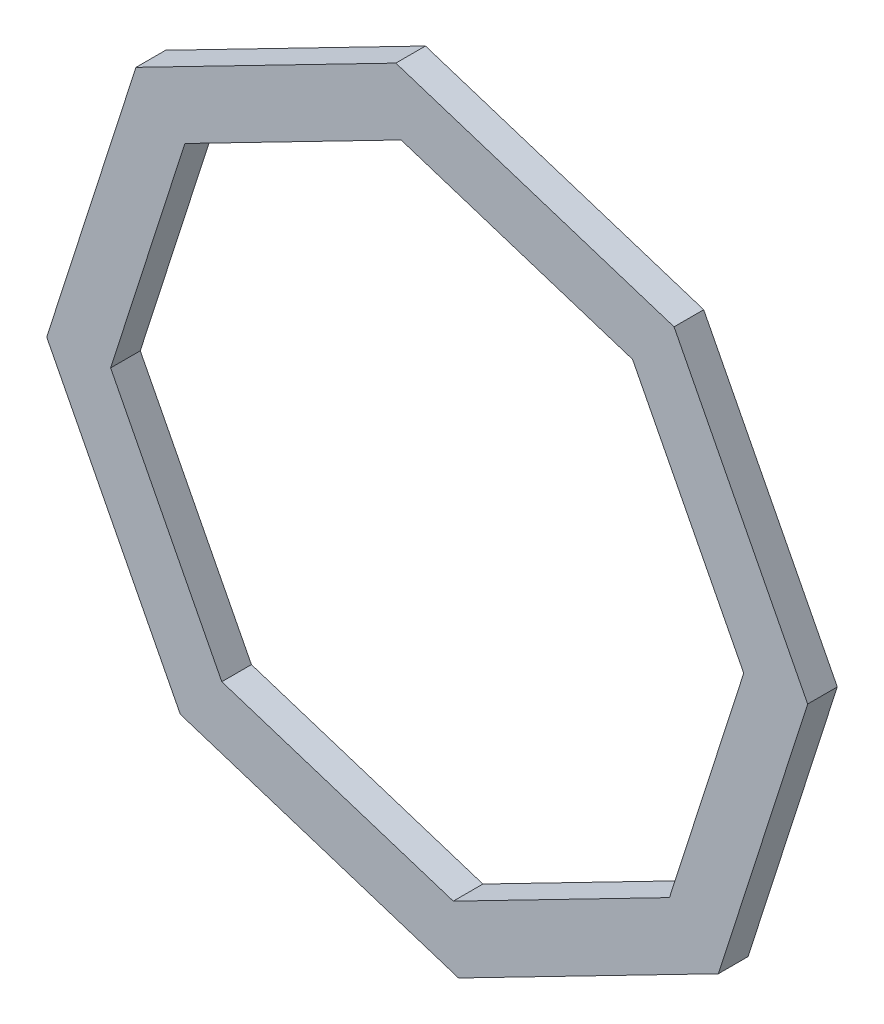
ISO-10303-21;
HEADER;
FILE_DESCRIPTION(('STEP AP214'),'2;1');
FILE_NAME('part.step','',(''),(''),'','','');
FILE_SCHEMA(('AUTOMOTIVE_DESIGN { 1 0 10303 214 1 1 1 1 }'));
ENDSEC;
DATA;
#1=APPLICATION_CONTEXT('core data for automotive mechanical design processes');
#2=APPLICATION_PROTOCOL_DEFINITION('international standard','automotive_design',2000,#1);
#3=PRODUCT_CONTEXT('',#1,'mechanical');
#4=PRODUCT('Part','Part','',(#3));
#5=PRODUCT_RELATED_PRODUCT_CATEGORY('part','',(#4));
#6=PRODUCT_DEFINITION_FORMATION('','',#4);
#7=PRODUCT_DEFINITION_CONTEXT('part definition',#1,'design');
#8=PRODUCT_DEFINITION('design','',#6,#7);
#9=PRODUCT_DEFINITION_SHAPE('','',#8);
#10=(LENGTH_UNIT() NAMED_UNIT(*) SI_UNIT(.MILLI.,.METRE.));
#11=(NAMED_UNIT(*) PLANE_ANGLE_UNIT() SI_UNIT($,.RADIAN.));
#12=(NAMED_UNIT(*) SI_UNIT($,.STERADIAN.) SOLID_ANGLE_UNIT());
#13=UNCERTAINTY_MEASURE_WITH_UNIT(LENGTH_MEASURE(1.E-05),#10,'distance_accuracy_value','');
#14=(GEOMETRIC_REPRESENTATION_CONTEXT(3) GLOBAL_UNCERTAINTY_ASSIGNED_CONTEXT((#13)) GLOBAL_UNIT_ASSIGNED_CONTEXT((#10,
#11,#12)) REPRESENTATION_CONTEXT('',''));
#15=CARTESIAN_POINT('',(0.,0.,0.));
#16=DIRECTION('',(0.,0.,1.));
#17=DIRECTION('',(1.,0.,0.));
#18=AXIS2_PLACEMENT_3D('',#15,#16,#17);
#19=CARTESIAN_POINT('',(0.,0.,5.));
#20=DIRECTION('',(0.,0.,1.));
#21=DIRECTION('',(1.,0.,0.));
#22=AXIS2_PLACEMENT_3D('',#19,#20,#21);
#23=PLANE('',#22);
#24=DIRECTION('',(-0.457266903218914,0.889329511047837,0.));
#25=VECTOR('',#24,1.);
#26=CARTESIAN_POINT('',(64.2063467204141,5.29100411146031,5.));
#27=LINE('',#26,#25);
#28=CARTESIAN_POINT('',(64.2063467204141,5.29100411146031,5.));
#29=VERTEX_POINT('',#28);
#30=CARTESIAN_POINT('',(41.65943827472,49.142048047719,5.));
#31=VERTEX_POINT('',#30);
#32=EDGE_CURVE('E211',#29,#31,#27,.T.);
#33=ORIENTED_EDGE('',*,*,#32,.T.);
#34=DIRECTION('',(-0.952187456049509,0.305514399892976,0.));
#35=VECTOR('',#34,1.);
#36=CARTESIAN_POINT('',(41.65943827472,49.142048047719,5.));
#37=LINE('',#36,#35);
#38=CARTESIAN_POINT('',(-5.29100411146032,64.2063467204141,5.));
#39=VERTEX_POINT('',#38);
#40=EDGE_CURVE('E214',#31,#39,#37,.T.);
#41=ORIENTED_EDGE('',*,*,#40,.T.);
#42=DIRECTION('',(-0.889329511047837,-0.457266903218914,0.));
#43=VECTOR('',#42,1.);
#44=CARTESIAN_POINT('',(-5.29100411146032,64.2063467204141,5.));
#45=LINE('',#44,#43);
#46=CARTESIAN_POINT('',(-49.142048047719,41.65943827472,5.));
#47=VERTEX_POINT('',#46);
#48=EDGE_CURVE('E217',#39,#47,#45,.T.);
#49=ORIENTED_EDGE('',*,*,#48,.T.);
#50=DIRECTION('',(-0.305514399892975,-0.952187456049509,0.));
#51=VECTOR('',#50,1.);
#52=CARTESIAN_POINT('',(-49.142048047719,41.65943827472,5.));
#53=LINE('',#52,#51);
#54=CARTESIAN_POINT('',(-64.2063467204141,-5.29100411146034,5.));
#55=VERTEX_POINT('',#54);
#56=EDGE_CURVE('E219',#47,#55,#53,.T.);
#57=ORIENTED_EDGE('',*,*,#56,.T.);
#58=DIRECTION('',(0.457266903218914,-0.889329511047837,0.));
#59=VECTOR('',#58,1.);
#60=CARTESIAN_POINT('',(-64.2063467204141,-5.29100411146034,5.));
#61=LINE('',#60,#59);
#62=CARTESIAN_POINT('',(-41.65943827472,-49.142048047719,5.));
#63=VERTEX_POINT('',#62);
#64=EDGE_CURVE('E221',#55,#63,#61,.T.);
#65=ORIENTED_EDGE('',*,*,#64,.T.);
#66=DIRECTION('',(0.952187456049509,-0.305514399892976,0.));
#67=VECTOR('',#66,1.);
#68=CARTESIAN_POINT('',(-41.65943827472,-49.142048047719,5.));
#69=LINE('',#68,#67);
#70=CARTESIAN_POINT('',(5.29100411146029,-64.2063467204142,5.));
#71=VERTEX_POINT('',#70);
#72=EDGE_CURVE('E223',#63,#71,#69,.T.);
#73=ORIENTED_EDGE('',*,*,#72,.T.);
#74=DIRECTION('',(0.889329511047837,0.457266903218914,0.));
#75=VECTOR('',#74,1.);
#76=CARTESIAN_POINT('',(5.29100411146029,-64.2063467204142,5.));
#77=LINE('',#76,#75);
#78=CARTESIAN_POINT('',(49.142048047719,-41.65943827472,5.));
#79=VERTEX_POINT('',#78);
#80=EDGE_CURVE('E225',#71,#79,#77,.T.);
#81=ORIENTED_EDGE('',*,*,#80,.T.);
#82=DIRECTION('',(0.305514399892976,0.952187456049509,0.));
#83=VECTOR('',#82,1.);
#84=CARTESIAN_POINT('',(49.142048047719,-41.65943827472,5.));
#85=LINE('',#84,#83);
#86=EDGE_CURVE('E227',#79,#29,#85,.T.);
#87=ORIENTED_EDGE('',*,*,#86,.T.);
#88=EDGE_LOOP('',(#33,#41,#49,#57,#65,#73,#81,#87));
#89=FACE_BOUND('',#88,.T.);
#90=DIRECTION('',(-0.952187456049509,0.305514399892976,0.));
#91=VECTOR('',#90,1.);
#92=CARTESIAN_POINT('',(34.6602046936178,40.8856555665834,5.));
#93=LINE('',#92,#91);
#94=CARTESIAN_POINT('',(34.6602046936178,40.8856555665834,5.));
#95=VERTEX_POINT('',#94);
#96=CARTESIAN_POINT('',(-4.40205852821764,53.4189900805596,5.));
#97=VERTEX_POINT('',#96);
#98=EDGE_CURVE('E154',#95,#97,#93,.T.);
#99=ORIENTED_EDGE('',*,*,#98,.F.);
#100=DIRECTION('',(-0.457266903218914,0.889329511047837,0.));
#101=VECTOR('',#100,1.);
#102=CARTESIAN_POINT('',(53.4189900805596,4.40205852821764,5.));
#103=LINE('',#102,#101);
#104=CARTESIAN_POINT('',(53.4189900805596,4.40205852821764,5.));
#105=VERTEX_POINT('',#104);
#106=EDGE_CURVE('E146',#105,#95,#103,.T.);
#107=ORIENTED_EDGE('',*,*,#106,.F.);
#108=DIRECTION('',(0.305514399892976,0.952187456049509,0.));
#109=VECTOR('',#108,1.);
#110=CARTESIAN_POINT('',(40.8856555665834,-34.6602046936178,5.));
#111=LINE('',#110,#109);
#112=CARTESIAN_POINT('',(40.8856555665834,-34.6602046936178,5.));
#113=VERTEX_POINT('',#112);
#114=EDGE_CURVE('E179',#113,#105,#111,.T.);
#115=ORIENTED_EDGE('',*,*,#114,.F.);
#116=DIRECTION('',(0.889329511047837,0.457266903218914,0.));
#117=VECTOR('',#116,1.);
#118=CARTESIAN_POINT('',(4.40205852821763,-53.4189900805596,5.));
#119=LINE('',#118,#117);
#120=CARTESIAN_POINT('',(4.40205852821763,-53.4189900805596,5.));
#121=VERTEX_POINT('',#120);
#122=EDGE_CURVE('E177',#121,#113,#119,.T.);
#123=ORIENTED_EDGE('',*,*,#122,.F.);
#124=DIRECTION('',(0.952187456049509,-0.305514399892976,0.));
#125=VECTOR('',#124,1.);
#126=CARTESIAN_POINT('',(-34.6602046936178,-40.8856555665834,5.));
#127=LINE('',#126,#125);
#128=CARTESIAN_POINT('',(-34.6602046936178,-40.8856555665834,5.));
#129=VERTEX_POINT('',#128);
#130=EDGE_CURVE('E175',#129,#121,#127,.T.);
#131=ORIENTED_EDGE('',*,*,#130,.F.);
#132=DIRECTION('',(0.457266903218914,-0.889329511047837,0.));
#133=VECTOR('',#132,1.);
#134=CARTESIAN_POINT('',(-53.4189900805596,-4.40205852821767,5.));
#135=LINE('',#134,#133);
#136=CARTESIAN_POINT('',(-53.4189900805596,-4.40205852821767,5.));
#137=VERTEX_POINT('',#136);
#138=EDGE_CURVE('E173',#137,#129,#135,.T.);
#139=ORIENTED_EDGE('',*,*,#138,.F.);
#140=DIRECTION('',(-0.305514399892976,-0.952187456049509,0.));
#141=VECTOR('',#140,1.);
#142=CARTESIAN_POINT('',(-40.8856555665834,34.6602046936178,5.));
#143=LINE('',#142,#141);
#144=CARTESIAN_POINT('',(-40.8856555665834,34.6602046936178,5.));
#145=VERTEX_POINT('',#144);
#146=EDGE_CURVE('E169',#145,#137,#143,.T.);
#147=ORIENTED_EDGE('',*,*,#146,.F.);
#148=DIRECTION('',(-0.889329511047837,-0.457266903218914,0.));
#149=VECTOR('',#148,1.);
#150=CARTESIAN_POINT('',(-4.40205852821764,53.4189900805596,5.));
#151=LINE('',#150,#149);
#152=EDGE_CURVE('E167',#97,#145,#151,.T.);
#153=ORIENTED_EDGE('',*,*,#152,.F.);
#154=EDGE_LOOP('',(#99,#107,#115,#123,#131,#139,#147,#153));
#155=FACE_BOUND('',#154,.T.);
#156=ADVANCED_FACE('F33',(#89,#155),#23,.T.);
#157=CARTESIAN_POINT('',(0.,0.,0.));
#158=DIRECTION('',(0.,0.,1.));
#159=DIRECTION('',(1.,0.,0.));
#160=AXIS2_PLACEMENT_3D('',#157,#158,#159);
#161=PLANE('',#160);
#162=DIRECTION('',(-0.457266903218914,0.889329511047837,0.));
#163=VECTOR('',#162,1.);
#164=CARTESIAN_POINT('',(64.2063467204141,5.29100411146031,0.));
#165=LINE('',#164,#163);
#166=CARTESIAN_POINT('',(64.2063467204141,5.29100411146031,0.));
#167=VERTEX_POINT('',#166);
#168=CARTESIAN_POINT('',(41.65943827472,49.142048047719,0.));
#169=VERTEX_POINT('',#168);
#170=EDGE_CURVE('E162',#167,#169,#165,.T.);
#171=ORIENTED_EDGE('',*,*,#170,.F.);
#172=DIRECTION('',(0.305514399892976,0.952187456049509,0.));
#173=VECTOR('',#172,1.);
#174=CARTESIAN_POINT('',(49.142048047719,-41.65943827472,0.));
#175=LINE('',#174,#173);
#176=CARTESIAN_POINT('',(49.142048047719,-41.65943827472,0.));
#177=VERTEX_POINT('',#176);
#178=EDGE_CURVE('E215',#177,#167,#175,.T.);
#179=ORIENTED_EDGE('',*,*,#178,.F.);
#180=DIRECTION('',(0.889329511047837,0.457266903218914,0.));
#181=VECTOR('',#180,1.);
#182=CARTESIAN_POINT('',(5.29100411146029,-64.2063467204142,0.));
#183=LINE('',#182,#181);
#184=CARTESIAN_POINT('',(5.29100411146029,-64.2063467204142,0.));
#185=VERTEX_POINT('',#184);
#186=EDGE_CURVE('E242',#185,#177,#183,.T.);
#187=ORIENTED_EDGE('',*,*,#186,.F.);
#188=DIRECTION('',(0.952187456049509,-0.305514399892976,0.));
#189=VECTOR('',#188,1.);
#190=CARTESIAN_POINT('',(-41.65943827472,-49.142048047719,0.));
#191=LINE('',#190,#189);
#192=CARTESIAN_POINT('',(-41.65943827472,-49.142048047719,0.));
#193=VERTEX_POINT('',#192);
#194=EDGE_CURVE('E240',#193,#185,#191,.T.);
#195=ORIENTED_EDGE('',*,*,#194,.F.);
#196=DIRECTION('',(0.457266903218914,-0.889329511047837,0.));
#197=VECTOR('',#196,1.);
#198=CARTESIAN_POINT('',(-64.2063467204141,-5.29100411146034,0.));
#199=LINE('',#198,#197);
#200=CARTESIAN_POINT('',(-64.2063467204141,-5.29100411146034,0.));
#201=VERTEX_POINT('',#200);
#202=EDGE_CURVE('E238',#201,#193,#199,.T.);
#203=ORIENTED_EDGE('',*,*,#202,.F.);
#204=DIRECTION('',(-0.305514399892975,-0.952187456049509,0.));
#205=VECTOR('',#204,1.);
#206=CARTESIAN_POINT('',(-49.142048047719,41.65943827472,0.));
#207=LINE('',#206,#205);
#208=CARTESIAN_POINT('',(-49.142048047719,41.65943827472,0.));
#209=VERTEX_POINT('',#208);
#210=EDGE_CURVE('E236',#209,#201,#207,.T.);
#211=ORIENTED_EDGE('',*,*,#210,.F.);
#212=DIRECTION('',(-0.889329511047837,-0.457266903218914,0.));
#213=VECTOR('',#212,1.);
#214=CARTESIAN_POINT('',(-5.29100411146032,64.2063467204141,0.));
#215=LINE('',#214,#213);
#216=CARTESIAN_POINT('',(-5.29100411146032,64.2063467204141,0.));
#217=VERTEX_POINT('',#216);
#218=EDGE_CURVE('E234',#217,#209,#215,.T.);
#219=ORIENTED_EDGE('',*,*,#218,.F.);
#220=DIRECTION('',(-0.952187456049509,0.305514399892976,0.));
#221=VECTOR('',#220,1.);
#222=CARTESIAN_POINT('',(41.65943827472,49.142048047719,0.));
#223=LINE('',#222,#221);
#224=EDGE_CURVE('E232',#169,#217,#223,.T.);
#225=ORIENTED_EDGE('',*,*,#224,.F.);
#226=EDGE_LOOP('',(#171,#179,#187,#195,#203,#211,#219,#225));
#227=FACE_BOUND('',#226,.T.);
#228=DIRECTION('',(-0.457266903218914,0.889329511047837,0.));
#229=VECTOR('',#228,1.);
#230=CARTESIAN_POINT('',(53.4189900805596,4.40205852821764,0.));
#231=LINE('',#230,#229);
#232=CARTESIAN_POINT('',(53.4189900805596,4.40205852821764,0.));
#233=VERTEX_POINT('',#232);
#234=CARTESIAN_POINT('',(34.6602046936178,40.8856555665834,0.));
#235=VERTEX_POINT('',#234);
#236=EDGE_CURVE('E56',#233,#235,#231,.T.);
#237=ORIENTED_EDGE('',*,*,#236,.T.);
#238=DIRECTION('',(-0.952187456049509,0.305514399892976,0.));
#239=VECTOR('',#238,1.);
#240=CARTESIAN_POINT('',(34.6602046936178,40.8856555665834,0.));
#241=LINE('',#240,#239);
#242=CARTESIAN_POINT('',(-4.40205852821764,53.4189900805596,0.));
#243=VERTEX_POINT('',#242);
#244=EDGE_CURVE('E161',#235,#243,#241,.T.);
#245=ORIENTED_EDGE('',*,*,#244,.T.);
#246=DIRECTION('',(-0.889329511047837,-0.457266903218914,0.));
#247=VECTOR('',#246,1.);
#248=CARTESIAN_POINT('',(-4.40205852821764,53.4189900805596,0.));
#249=LINE('',#248,#247);
#250=CARTESIAN_POINT('',(-40.8856555665834,34.6602046936178,0.));
#251=VERTEX_POINT('',#250);
#252=EDGE_CURVE('E183',#243,#251,#249,.T.);
#253=ORIENTED_EDGE('',*,*,#252,.T.);
#254=DIRECTION('',(-0.305514399892976,-0.952187456049509,0.));
#255=VECTOR('',#254,1.);
#256=CARTESIAN_POINT('',(-40.8856555665834,34.6602046936178,0.));
#257=LINE('',#256,#255);
#258=CARTESIAN_POINT('',(-53.4189900805596,-4.40205852821767,0.));
#259=VERTEX_POINT('',#258);
#260=EDGE_CURVE('E186',#251,#259,#257,.T.);
#261=ORIENTED_EDGE('',*,*,#260,.T.);
#262=DIRECTION('',(0.457266903218914,-0.889329511047837,0.));
#263=VECTOR('',#262,1.);
#264=CARTESIAN_POINT('',(-53.4189900805596,-4.40205852821767,0.));
#265=LINE('',#264,#263);
#266=CARTESIAN_POINT('',(-34.6602046936178,-40.8856555665834,0.));
#267=VERTEX_POINT('',#266);
#268=EDGE_CURVE('E189',#259,#267,#265,.T.);
#269=ORIENTED_EDGE('',*,*,#268,.T.);
#270=DIRECTION('',(0.952187456049509,-0.305514399892976,0.));
#271=VECTOR('',#270,1.);
#272=CARTESIAN_POINT('',(-34.6602046936178,-40.8856555665834,0.));
#273=LINE('',#272,#271);
#274=CARTESIAN_POINT('',(4.40205852821763,-53.4189900805596,0.));
#275=VERTEX_POINT('',#274);
#276=EDGE_CURVE('E192',#267,#275,#273,.T.);
#277=ORIENTED_EDGE('',*,*,#276,.T.);
#278=DIRECTION('',(0.889329511047837,0.457266903218914,0.));
#279=VECTOR('',#278,1.);
#280=CARTESIAN_POINT('',(4.40205852821763,-53.4189900805596,0.));
#281=LINE('',#280,#279);
#282=CARTESIAN_POINT('',(40.8856555665834,-34.6602046936178,0.));
#283=VERTEX_POINT('',#282);
#284=EDGE_CURVE('E195',#275,#283,#281,.T.);
#285=ORIENTED_EDGE('',*,*,#284,.T.);
#286=DIRECTION('',(0.305514399892976,0.952187456049509,0.));
#287=VECTOR('',#286,1.);
#288=CARTESIAN_POINT('',(40.8856555665834,-34.6602046936178,0.));
#289=LINE('',#288,#287);
#290=EDGE_CURVE('E155',#283,#233,#289,.T.);
#291=ORIENTED_EDGE('',*,*,#290,.T.);
#292=EDGE_LOOP('',(#237,#245,#253,#261,#269,#277,#285,#291));
#293=FACE_BOUND('',#292,.T.);
#294=ADVANCED_FACE('F272',(#227,#293),#161,.F.);
#295=CARTESIAN_POINT('',(64.2063467204141,5.29100411146031,5.));
#296=DIRECTION('',(-0.889329511047837,-0.457266903218914,0.));
#297=DIRECTION('',(0.457266903218914,-0.889329511047837,0.));
#298=AXIS2_PLACEMENT_3D('',#295,#296,#297);
#299=PLANE('',#298);
#300=ORIENTED_EDGE('',*,*,#170,.T.);
#301=DIRECTION('',(0.,0.,-1.));
#302=VECTOR('',#301,1.);
#303=CARTESIAN_POINT('',(41.65943827472,49.142048047719,5.));
#304=LINE('',#303,#302);
#305=EDGE_CURVE('E11',#31,#169,#304,.T.);
#306=ORIENTED_EDGE('',*,*,#305,.F.);
#307=ORIENTED_EDGE('',*,*,#32,.F.);
#308=DIRECTION('',(0.,0.,-1.));
#309=VECTOR('',#308,1.);
#310=CARTESIAN_POINT('',(64.2063467204141,5.29100411146031,5.));
#311=LINE('',#310,#309);
#312=EDGE_CURVE('E229',#29,#167,#311,.T.);
#313=ORIENTED_EDGE('',*,*,#312,.T.);
#314=EDGE_LOOP('',(#300,#306,#307,#313));
#315=FACE_BOUND('',#314,.T.);
#316=ADVANCED_FACE('F35',(#315),#299,.F.);
#317=CARTESIAN_POINT('',(41.65943827472,49.142048047719,5.));
#318=DIRECTION('',(-0.305514399892976,-0.952187456049509,0.));
#319=DIRECTION('',(0.952187456049509,-0.305514399892976,0.));
#320=AXIS2_PLACEMENT_3D('',#317,#318,#319);
#321=PLANE('',#320);
#322=ORIENTED_EDGE('',*,*,#224,.T.);
#323=DIRECTION('',(0.,0.,-1.));
#324=VECTOR('',#323,1.);
#325=CARTESIAN_POINT('',(-5.29100411146032,64.2063467204141,5.));
#326=LINE('',#325,#324);
#327=EDGE_CURVE('E41',#39,#217,#326,.T.);
#328=ORIENTED_EDGE('',*,*,#327,.F.);
#329=ORIENTED_EDGE('',*,*,#40,.F.);
#330=ORIENTED_EDGE('',*,*,#305,.T.);
#331=EDGE_LOOP('',(#322,#328,#329,#330));
#332=FACE_BOUND('',#331,.T.);
#333=ADVANCED_FACE('F289',(#332),#321,.F.);
#334=CARTESIAN_POINT('',(-5.29100411146032,64.2063467204141,5.));
#335=DIRECTION('',(0.457266903218914,-0.889329511047837,0.));
#336=DIRECTION('',(0.889329511047837,0.457266903218914,0.));
#337=AXIS2_PLACEMENT_3D('',#334,#335,#336);
#338=PLANE('',#337);
#339=ORIENTED_EDGE('',*,*,#218,.T.);
#340=DIRECTION('',(0.,0.,-1.));
#341=VECTOR('',#340,1.);
#342=CARTESIAN_POINT('',(-49.142048047719,41.65943827472,5.));
#343=LINE('',#342,#341);
#344=EDGE_CURVE('E259',#47,#209,#343,.T.);
#345=ORIENTED_EDGE('',*,*,#344,.F.);
#346=ORIENTED_EDGE('',*,*,#48,.F.);
#347=ORIENTED_EDGE('',*,*,#327,.T.);
#348=EDGE_LOOP('',(#339,#345,#346,#347));
#349=FACE_BOUND('',#348,.T.);
#350=ADVANCED_FACE('F266',(#349),#338,.F.);
#351=CARTESIAN_POINT('',(-49.142048047719,41.65943827472,5.));
#352=DIRECTION('',(0.952187456049509,-0.305514399892975,0.));
#353=DIRECTION('',(0.305514399892975,0.952187456049509,0.));
#354=AXIS2_PLACEMENT_3D('',#351,#352,#353);
#355=PLANE('',#354);
#356=ORIENTED_EDGE('',*,*,#210,.T.);
#357=DIRECTION('',(0.,0.,-1.));
#358=VECTOR('',#357,1.);
#359=CARTESIAN_POINT('',(-64.2063467204141,-5.29100411146034,5.));
#360=LINE('',#359,#358);
#361=EDGE_CURVE('E256',#55,#201,#360,.T.);
#362=ORIENTED_EDGE('',*,*,#361,.F.);
#363=ORIENTED_EDGE('',*,*,#56,.F.);
#364=ORIENTED_EDGE('',*,*,#344,.T.);
#365=EDGE_LOOP('',(#356,#362,#363,#364));
#366=FACE_BOUND('',#365,.T.);
#367=ADVANCED_FACE('F278',(#366),#355,.F.);
#368=CARTESIAN_POINT('',(-64.2063467204141,-5.29100411146034,5.));
#369=DIRECTION('',(0.889329511047837,0.457266903218914,0.));
#370=DIRECTION('',(-0.457266903218914,0.889329511047837,0.));
#371=AXIS2_PLACEMENT_3D('',#368,#369,#370);
#372=PLANE('',#371);
#373=ORIENTED_EDGE('',*,*,#202,.T.);
#374=DIRECTION('',(0.,0.,-1.));
#375=VECTOR('',#374,1.);
#376=CARTESIAN_POINT('',(-41.65943827472,-49.142048047719,5.));
#377=LINE('',#376,#375);
#378=EDGE_CURVE('E253',#63,#193,#377,.T.);
#379=ORIENTED_EDGE('',*,*,#378,.F.);
#380=ORIENTED_EDGE('',*,*,#64,.F.);
#381=ORIENTED_EDGE('',*,*,#361,.T.);
#382=EDGE_LOOP('',(#373,#379,#380,#381));
#383=FACE_BOUND('',#382,.T.);
#384=ADVANCED_FACE('F282',(#383),#372,.F.);
#385=CARTESIAN_POINT('',(-41.65943827472,-49.142048047719,5.));
#386=DIRECTION('',(0.305514399892976,0.952187456049509,0.));
#387=DIRECTION('',(-0.952187456049509,0.305514399892976,0.));
#388=AXIS2_PLACEMENT_3D('',#385,#386,#387);
#389=PLANE('',#388);
#390=ORIENTED_EDGE('',*,*,#194,.T.);
#391=DIRECTION('',(0.,0.,-1.));
#392=VECTOR('',#391,1.);
#393=CARTESIAN_POINT('',(5.29100411146029,-64.2063467204142,5.));
#394=LINE('',#393,#392);
#395=EDGE_CURVE('E250',#71,#185,#394,.T.);
#396=ORIENTED_EDGE('',*,*,#395,.F.);
#397=ORIENTED_EDGE('',*,*,#72,.F.);
#398=ORIENTED_EDGE('',*,*,#378,.T.);
#399=EDGE_LOOP('',(#390,#396,#397,#398));
#400=FACE_BOUND('',#399,.T.);
#401=ADVANCED_FACE('F302',(#400),#389,.F.);
#402=CARTESIAN_POINT('',(5.29100411146029,-64.2063467204142,5.));
#403=DIRECTION('',(-0.457266903218914,0.889329511047837,0.));
#404=DIRECTION('',(-0.889329511047837,-0.457266903218914,0.));
#405=AXIS2_PLACEMENT_3D('',#402,#403,#404);
#406=PLANE('',#405);
#407=ORIENTED_EDGE('',*,*,#186,.T.);
#408=DIRECTION('',(0.,0.,-1.));
#409=VECTOR('',#408,1.);
#410=CARTESIAN_POINT('',(49.142048047719,-41.65943827472,5.));
#411=LINE('',#410,#409);
#412=EDGE_CURVE('E247',#79,#177,#411,.T.);
#413=ORIENTED_EDGE('',*,*,#412,.F.);
#414=ORIENTED_EDGE('',*,*,#80,.F.);
#415=ORIENTED_EDGE('',*,*,#395,.T.);
#416=EDGE_LOOP('',(#407,#413,#414,#415));
#417=FACE_BOUND('',#416,.T.);
#418=ADVANCED_FACE('F300',(#417),#406,.F.);
#419=CARTESIAN_POINT('',(49.142048047719,-41.65943827472,5.));
#420=DIRECTION('',(-0.952187456049509,0.305514399892976,0.));
#421=DIRECTION('',(-0.305514399892976,-0.952187456049509,0.));
#422=AXIS2_PLACEMENT_3D('',#419,#420,#421);
#423=PLANE('',#422);
#424=ORIENTED_EDGE('',*,*,#178,.T.);
#425=ORIENTED_EDGE('',*,*,#312,.F.);
#426=ORIENTED_EDGE('',*,*,#86,.F.);
#427=ORIENTED_EDGE('',*,*,#412,.T.);
#428=EDGE_LOOP('',(#424,#425,#426,#427));
#429=FACE_BOUND('',#428,.T.);
#430=ADVANCED_FACE('F295',(#429),#423,.F.);
#431=CARTESIAN_POINT('',(53.4189900805596,4.40205852821764,5.));
#432=DIRECTION('',(-0.889329511047837,-0.457266903218914,0.));
#433=DIRECTION('',(0.457266903218914,-0.889329511047837,0.));
#434=AXIS2_PLACEMENT_3D('',#431,#432,#433);
#435=PLANE('',#434);
#436=ORIENTED_EDGE('',*,*,#236,.F.);
#437=DIRECTION('',(0.,0.,-1.));
#438=VECTOR('',#437,1.);
#439=CARTESIAN_POINT('',(53.4189900805596,4.40205852821764,5.));
#440=LINE('',#439,#438);
#441=EDGE_CURVE('E150',#105,#233,#440,.T.);
#442=ORIENTED_EDGE('',*,*,#441,.F.);
#443=ORIENTED_EDGE('',*,*,#106,.T.);
#444=DIRECTION('',(0.,0.,-1.));
#445=VECTOR('',#444,1.);
#446=CARTESIAN_POINT('',(34.6602046936178,40.8856555665834,5.));
#447=LINE('',#446,#445);
#448=EDGE_CURVE('E149',#95,#235,#447,.T.);
#449=ORIENTED_EDGE('',*,*,#448,.T.);
#450=EDGE_LOOP('',(#436,#442,#443,#449));
#451=FACE_BOUND('',#450,.T.);
#452=ADVANCED_FACE('F148',(#451),#435,.T.);
#453=CARTESIAN_POINT('',(34.6602046936178,40.8856555665834,5.));
#454=DIRECTION('',(-0.305514399892976,-0.952187456049509,0.));
#455=DIRECTION('',(0.952187456049509,-0.305514399892976,0.));
#456=AXIS2_PLACEMENT_3D('',#453,#454,#455);
#457=PLANE('',#456);
#458=ORIENTED_EDGE('',*,*,#244,.F.);
#459=ORIENTED_EDGE('',*,*,#448,.F.);
#460=ORIENTED_EDGE('',*,*,#98,.T.);
#461=DIRECTION('',(0.,0.,-1.));
#462=VECTOR('',#461,1.);
#463=CARTESIAN_POINT('',(-4.40205852821764,53.4189900805596,5.));
#464=LINE('',#463,#462);
#465=EDGE_CURVE('E163',#97,#243,#464,.T.);
#466=ORIENTED_EDGE('',*,*,#465,.T.);
#467=EDGE_LOOP('',(#458,#459,#460,#466));
#468=FACE_BOUND('',#467,.T.);
#469=ADVANCED_FACE('F158',(#468),#457,.T.);
#470=CARTESIAN_POINT('',(-4.40205852821764,53.4189900805596,5.));
#471=DIRECTION('',(0.457266903218914,-0.889329511047837,0.));
#472=DIRECTION('',(0.889329511047837,0.457266903218914,0.));
#473=AXIS2_PLACEMENT_3D('',#470,#471,#472);
#474=PLANE('',#473);
#475=ORIENTED_EDGE('',*,*,#252,.F.);
#476=ORIENTED_EDGE('',*,*,#465,.F.);
#477=ORIENTED_EDGE('',*,*,#152,.T.);
#478=DIRECTION('',(0.,0.,-1.));
#479=VECTOR('',#478,1.);
#480=CARTESIAN_POINT('',(-40.8856555665834,34.6602046936178,5.));
#481=LINE('',#480,#479);
#482=EDGE_CURVE('E208',#145,#251,#481,.T.);
#483=ORIENTED_EDGE('',*,*,#482,.T.);
#484=EDGE_LOOP('',(#475,#476,#477,#483));
#485=FACE_BOUND('',#484,.T.);
#486=ADVANCED_FACE('F327',(#485),#474,.T.);
#487=CARTESIAN_POINT('',(-40.8856555665834,34.6602046936178,5.));
#488=DIRECTION('',(0.952187456049509,-0.305514399892976,0.));
#489=DIRECTION('',(0.305514399892976,0.952187456049509,0.));
#490=AXIS2_PLACEMENT_3D('',#487,#488,#489);
#491=PLANE('',#490);
#492=ORIENTED_EDGE('',*,*,#260,.F.);
#493=ORIENTED_EDGE('',*,*,#482,.F.);
#494=ORIENTED_EDGE('',*,*,#146,.T.);
#495=DIRECTION('',(0.,0.,-1.));
#496=VECTOR('',#495,1.);
#497=CARTESIAN_POINT('',(-53.4189900805596,-4.40205852821767,5.));
#498=LINE('',#497,#496);
#499=EDGE_CURVE('E206',#137,#259,#498,.T.);
#500=ORIENTED_EDGE('',*,*,#499,.T.);
#501=EDGE_LOOP('',(#492,#493,#494,#500));
#502=FACE_BOUND('',#501,.T.);
#503=ADVANCED_FACE('F331',(#502),#491,.T.);
#504=CARTESIAN_POINT('',(-53.4189900805596,-4.40205852821767,5.));
#505=DIRECTION('',(0.889329511047837,0.457266903218914,0.));
#506=DIRECTION('',(-0.457266903218914,0.889329511047837,0.));
#507=AXIS2_PLACEMENT_3D('',#504,#505,#506);
#508=PLANE('',#507);
#509=ORIENTED_EDGE('',*,*,#268,.F.);
#510=ORIENTED_EDGE('',*,*,#499,.F.);
#511=ORIENTED_EDGE('',*,*,#138,.T.);
#512=DIRECTION('',(0.,0.,-1.));
#513=VECTOR('',#512,1.);
#514=CARTESIAN_POINT('',(-34.6602046936178,-40.8856555665834,5.));
#515=LINE('',#514,#513);
#516=EDGE_CURVE('E204',#129,#267,#515,.T.);
#517=ORIENTED_EDGE('',*,*,#516,.T.);
#518=EDGE_LOOP('',(#509,#510,#511,#517));
#519=FACE_BOUND('',#518,.T.);
#520=ADVANCED_FACE('F337',(#519),#508,.T.);
#521=CARTESIAN_POINT('',(-34.6602046936178,-40.8856555665834,5.));
#522=DIRECTION('',(0.305514399892976,0.952187456049509,0.));
#523=DIRECTION('',(-0.952187456049509,0.305514399892976,0.));
#524=AXIS2_PLACEMENT_3D('',#521,#522,#523);
#525=PLANE('',#524);
#526=ORIENTED_EDGE('',*,*,#276,.F.);
#527=ORIENTED_EDGE('',*,*,#516,.F.);
#528=ORIENTED_EDGE('',*,*,#130,.T.);
#529=DIRECTION('',(0.,0.,-1.));
#530=VECTOR('',#529,1.);
#531=CARTESIAN_POINT('',(4.40205852821763,-53.4189900805596,5.));
#532=LINE('',#531,#530);
#533=EDGE_CURVE('E202',#121,#275,#532,.T.);
#534=ORIENTED_EDGE('',*,*,#533,.T.);
#535=EDGE_LOOP('',(#526,#527,#528,#534));
#536=FACE_BOUND('',#535,.T.);
#537=ADVANCED_FACE('F341',(#536),#525,.T.);
#538=CARTESIAN_POINT('',(4.40205852821763,-53.4189900805596,5.));
#539=DIRECTION('',(-0.457266903218914,0.889329511047837,0.));
#540=DIRECTION('',(-0.889329511047837,-0.457266903218914,0.));
#541=AXIS2_PLACEMENT_3D('',#538,#539,#540);
#542=PLANE('',#541);
#543=ORIENTED_EDGE('',*,*,#284,.F.);
#544=ORIENTED_EDGE('',*,*,#533,.F.);
#545=ORIENTED_EDGE('',*,*,#122,.T.);
#546=DIRECTION('',(0.,0.,-1.));
#547=VECTOR('',#546,1.);
#548=CARTESIAN_POINT('',(40.8856555665834,-34.6602046936178,5.));
#549=LINE('',#548,#547);
#550=EDGE_CURVE('E48',#113,#283,#549,.T.);
#551=ORIENTED_EDGE('',*,*,#550,.T.);
#552=EDGE_LOOP('',(#543,#544,#545,#551));
#553=FACE_BOUND('',#552,.T.);
#554=ADVANCED_FACE('F345',(#553),#542,.T.);
#555=CARTESIAN_POINT('',(40.8856555665834,-34.6602046936178,5.));
#556=DIRECTION('',(-0.952187456049509,0.305514399892976,0.));
#557=DIRECTION('',(-0.305514399892976,-0.952187456049509,0.));
#558=AXIS2_PLACEMENT_3D('',#555,#556,#557);
#559=PLANE('',#558);
#560=ORIENTED_EDGE('',*,*,#290,.F.);
#561=ORIENTED_EDGE('',*,*,#550,.F.);
#562=ORIENTED_EDGE('',*,*,#114,.T.);
#563=ORIENTED_EDGE('',*,*,#441,.T.);
#564=EDGE_LOOP('',(#560,#561,#562,#563));
#565=FACE_BOUND('',#564,.T.);
#566=ADVANCED_FACE('F349',(#565),#559,.T.);
#567=CLOSED_SHELL('',(#156,#294,#316,#333,#350,#367,#384,#401,#418,#430,#452,#469,#486,#503,
#520,#537,#554,#566));
#568=MANIFOLD_SOLID_BREP('B2',#567);
#569=ADVANCED_BREP_SHAPE_REPRESENTATION('',(#18,#568),#14);
#570=SHAPE_DEFINITION_REPRESENTATION(#9,#569);
ENDSEC;
END-ISO-10303-21;
